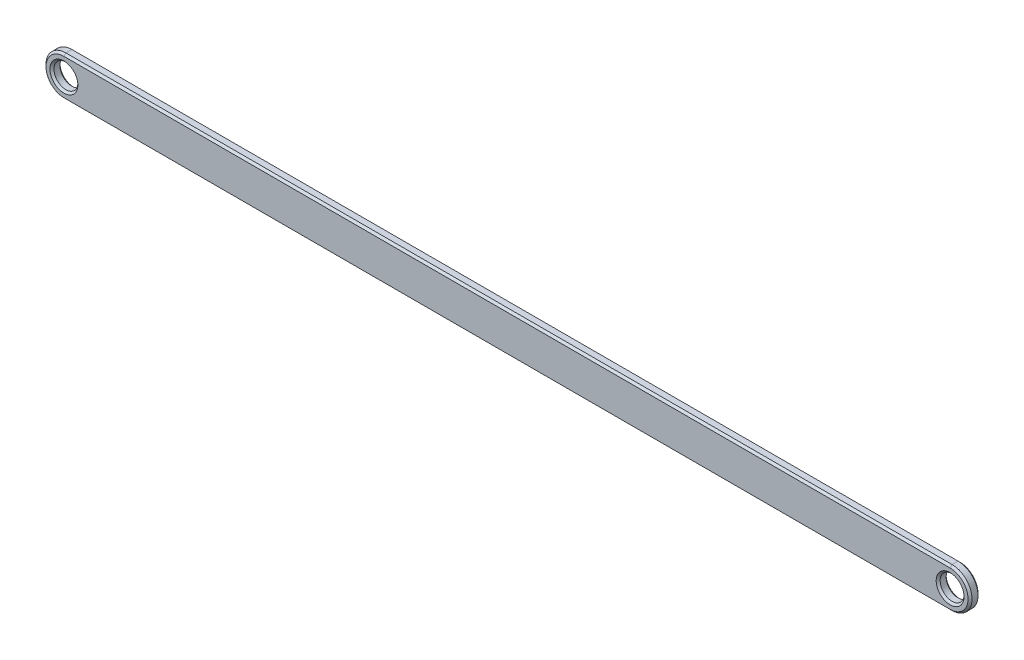
ISO-10303-21;
HEADER;
FILE_DESCRIPTION(('STEP AP214'),'2;1');
FILE_NAME('part.step','',(''),(''),'','','');
FILE_SCHEMA(('AUTOMOTIVE_DESIGN { 1 0 10303 214 1 1 1 1 }'));
ENDSEC;
DATA;
#1=APPLICATION_CONTEXT('core data for automotive mechanical design processes');
#2=APPLICATION_PROTOCOL_DEFINITION('international standard','automotive_design',2000,#1);
#3=PRODUCT_CONTEXT('',#1,'mechanical');
#4=PRODUCT('Part','Part','',(#3));
#5=PRODUCT_RELATED_PRODUCT_CATEGORY('part','',(#4));
#6=PRODUCT_DEFINITION_FORMATION('','',#4);
#7=PRODUCT_DEFINITION_CONTEXT('part definition',#1,'design');
#8=PRODUCT_DEFINITION('design','',#6,#7);
#9=PRODUCT_DEFINITION_SHAPE('','',#8);
#10=(LENGTH_UNIT() NAMED_UNIT(*) SI_UNIT(.MILLI.,.METRE.));
#11=(NAMED_UNIT(*) PLANE_ANGLE_UNIT() SI_UNIT($,.RADIAN.));
#12=(NAMED_UNIT(*) SI_UNIT($,.STERADIAN.) SOLID_ANGLE_UNIT());
#13=UNCERTAINTY_MEASURE_WITH_UNIT(LENGTH_MEASURE(1.E-05),#10,'distance_accuracy_value','');
#14=(GEOMETRIC_REPRESENTATION_CONTEXT(3) GLOBAL_UNCERTAINTY_ASSIGNED_CONTEXT((#13)) GLOBAL_UNIT_ASSIGNED_CONTEXT((#10,
#11,#12)) REPRESENTATION_CONTEXT('',''));
#15=CARTESIAN_POINT('',(0.,0.,0.));
#16=DIRECTION('',(0.,0.,1.));
#17=DIRECTION('',(1.,0.,0.));
#18=AXIS2_PLACEMENT_3D('',#15,#16,#17);
#19=CARTESIAN_POINT('',(-1112.5,0.,25.));
#20=DIRECTION('',(0.,0.,1.));
#21=DIRECTION('',(1.,0.,0.));
#22=AXIS2_PLACEMENT_3D('',#19,#20,#21);
#23=PLANE('',#22);
#24=CARTESIAN_POINT('',(1112.5,2.72483912810286E-13,25.));
#25=DIRECTION('',(0.,0.,1.));
#26=DIRECTION('',(1.,0.,0.));
#27=AXIS2_PLACEMENT_3D('',#24,#25,#26);
#28=CIRCLE('',#27,34.9999999999997);
#29=CARTESIAN_POINT('',(1147.5,2.72483912810286E-13,25.));
#30=VERTEX_POINT('',#29);
#31=EDGE_CURVE('E11',#30,#30,#28,.F.);
#32=ORIENTED_EDGE('',*,*,#31,.T.);
#33=EDGE_LOOP('',(#32));
#34=FACE_BOUND('',#33,.T.);
#35=CARTESIAN_POINT('',(1112.5,2.72483912810286E-13,25.));
#36=DIRECTION('',(0.,0.,1.));
#37=DIRECTION('',(1.,0.,0.));
#38=AXIS2_PLACEMENT_3D('',#35,#36,#37);
#39=CIRCLE('',#38,45.0000000000006);
#40=CARTESIAN_POINT('',(1112.5,-45.0000000000003,25.));
#41=VERTEX_POINT('',#40);
#42=CARTESIAN_POINT('',(1112.5,45.0000000000008,25.));
#43=VERTEX_POINT('',#42);
#44=EDGE_CURVE('E57',#41,#43,#39,.T.);
#45=ORIENTED_EDGE('',*,*,#44,.T.);
#46=DIRECTION('',(-1.,0.,0.));
#47=VECTOR('',#46,1.);
#48=CARTESIAN_POINT('',(-1112.5,45.0000000000005,25.));
#49=LINE('',#48,#47);
#50=CARTESIAN_POINT('',(-1112.5,45.0000000000006,25.));
#51=VERTEX_POINT('',#50);
#52=EDGE_CURVE('E49',#43,#51,#49,.T.);
#53=ORIENTED_EDGE('',*,*,#52,.T.);
#54=CARTESIAN_POINT('',(-1112.5,0.,25.));
#55=DIRECTION('',(0.,0.,1.));
#56=DIRECTION('',(1.,0.,0.));
#57=AXIS2_PLACEMENT_3D('',#54,#55,#56);
#58=CIRCLE('',#57,45.0000000000006);
#59=CARTESIAN_POINT('',(-1112.5,-45.0000000000006,25.));
#60=VERTEX_POINT('',#59);
#61=EDGE_CURVE('E194',#51,#60,#58,.T.);
#62=ORIENTED_EDGE('',*,*,#61,.T.);
#63=DIRECTION('',(1.,0.,0.));
#64=VECTOR('',#63,1.);
#65=CARTESIAN_POINT('',(1112.5,-45.0000000000003,25.));
#66=LINE('',#65,#64);
#67=EDGE_CURVE('E62',#60,#41,#66,.T.);
#68=ORIENTED_EDGE('',*,*,#67,.T.);
#69=EDGE_LOOP('',(#45,#53,#62,#68));
#70=FACE_BOUND('',#69,.T.);
#71=CARTESIAN_POINT('',(-1112.5,0.,25.));
#72=DIRECTION('',(0.,0.,1.));
#73=DIRECTION('',(1.,0.,0.));
#74=AXIS2_PLACEMENT_3D('',#71,#72,#73);
#75=CIRCLE('',#74,34.9999999999997);
#76=CARTESIAN_POINT('',(-1077.5,0.,25.));
#77=VERTEX_POINT('',#76);
#78=EDGE_CURVE('E190',#77,#77,#75,.F.);
#79=ORIENTED_EDGE('',*,*,#78,.T.);
#80=EDGE_LOOP('',(#79));
#81=FACE_BOUND('',#80,.T.);
#82=ADVANCED_FACE('F39',(#34,#70,#81),#23,.T.);
#83=CARTESIAN_POINT('',(-1112.5,0.,0.));
#84=DIRECTION('',(0.,0.,1.));
#85=DIRECTION('',(1.,0.,0.));
#86=AXIS2_PLACEMENT_3D('',#83,#84,#85);
#87=PLANE('',#86);
#88=CARTESIAN_POINT('',(1112.5,2.72483912810286E-13,0.));
#89=DIRECTION('',(0.,0.,1.));
#90=DIRECTION('',(1.,0.,0.));
#91=AXIS2_PLACEMENT_3D('',#88,#89,#90);
#92=CIRCLE('',#91,34.9999999999995);
#93=CARTESIAN_POINT('',(1147.5,2.72483912810286E-13,0.));
#94=VERTEX_POINT('',#93);
#95=EDGE_CURVE('E142',#94,#94,#92,.T.);
#96=ORIENTED_EDGE('',*,*,#95,.T.);
#97=EDGE_LOOP('',(#96));
#98=FACE_BOUND('',#97,.T.);
#99=CARTESIAN_POINT('',(-1112.5,0.,0.));
#100=DIRECTION('',(0.,0.,1.));
#101=DIRECTION('',(1.,0.,0.));
#102=AXIS2_PLACEMENT_3D('',#99,#100,#101);
#103=CIRCLE('',#102,34.9999999999995);
#104=CARTESIAN_POINT('',(-1077.5,0.,0.));
#105=VERTEX_POINT('',#104);
#106=EDGE_CURVE('E137',#105,#105,#103,.T.);
#107=ORIENTED_EDGE('',*,*,#106,.T.);
#108=EDGE_LOOP('',(#107));
#109=FACE_BOUND('',#108,.T.);
#110=CARTESIAN_POINT('',(1112.5,2.72483912810286E-13,0.));
#111=DIRECTION('',(0.,0.,1.));
#112=DIRECTION('',(1.,0.,0.));
#113=AXIS2_PLACEMENT_3D('',#110,#111,#112);
#114=CIRCLE('',#113,45.0000000000001);
#115=CARTESIAN_POINT('',(1112.5,45.0000000000004,0.));
#116=VERTEX_POINT('',#115);
#117=CARTESIAN_POINT('',(1112.5,-44.9999999999998,0.));
#118=VERTEX_POINT('',#117);
#119=EDGE_CURVE('E135',#116,#118,#114,.F.);
#120=ORIENTED_EDGE('',*,*,#119,.T.);
#121=DIRECTION('',(-1.,0.,0.));
#122=VECTOR('',#121,1.);
#123=CARTESIAN_POINT('',(-1112.5,-45.0000000000001,0.));
#124=LINE('',#123,#122);
#125=CARTESIAN_POINT('',(-1112.5,-45.0000000000001,0.));
#126=VERTEX_POINT('',#125);
#127=EDGE_CURVE('E112',#118,#126,#124,.T.);
#128=ORIENTED_EDGE('',*,*,#127,.T.);
#129=CARTESIAN_POINT('',(-1112.5,0.,0.));
#130=DIRECTION('',(0.,0.,1.));
#131=DIRECTION('',(1.,0.,0.));
#132=AXIS2_PLACEMENT_3D('',#129,#130,#131);
#133=CIRCLE('',#132,45.0000000000001);
#134=CARTESIAN_POINT('',(-1112.5,45.0000000000001,0.));
#135=VERTEX_POINT('',#134);
#136=EDGE_CURVE('E123',#126,#135,#133,.F.);
#137=ORIENTED_EDGE('',*,*,#136,.T.);
#138=DIRECTION('',(1.,0.,0.));
#139=VECTOR('',#138,1.);
#140=CARTESIAN_POINT('',(-1112.5,45.0000000000001,0.));
#141=LINE('',#140,#139);
#142=EDGE_CURVE('E130',#135,#116,#141,.T.);
#143=ORIENTED_EDGE('',*,*,#142,.T.);
#144=EDGE_LOOP('',(#120,#128,#137,#143));
#145=FACE_BOUND('',#144,.T.);
#146=ADVANCED_FACE('F133',(#98,#109,#145),#87,.F.);
#147=CARTESIAN_POINT('',(-1112.5,0.,25.));
#148=DIRECTION('',(0.,0.,-1.));
#149=DIRECTION('',(-1.,0.,0.));
#150=AXIS2_PLACEMENT_3D('',#147,#148,#149);
#151=CYLINDRICAL_SURFACE('',#150,50.);
#152=DIRECTION('',(0.,0.,-1.));
#153=VECTOR('',#152,1.);
#154=CARTESIAN_POINT('',(-1112.5,50.,25.));
#155=LINE('',#154,#153);
#156=CARTESIAN_POINT('',(-1112.5,50.,20.0000000000008));
#157=VERTEX_POINT('',#156);
#158=CARTESIAN_POINT('',(-1112.5,50.,4.9999999999999));
#159=VERTEX_POINT('',#158);
#160=EDGE_CURVE('E210',#157,#159,#155,.T.);
#161=ORIENTED_EDGE('',*,*,#160,.T.);
#162=CARTESIAN_POINT('',(-1112.5,0.,4.9999999999999));
#163=DIRECTION('',(0.,0.,1.));
#164=DIRECTION('',(1.,0.,0.));
#165=AXIS2_PLACEMENT_3D('',#162,#163,#164);
#166=CIRCLE('',#165,50.);
#167=CARTESIAN_POINT('',(-1112.5,-50.,4.9999999999999));
#168=VERTEX_POINT('',#167);
#169=EDGE_CURVE('E187',#159,#168,#166,.T.);
#170=ORIENTED_EDGE('',*,*,#169,.T.);
#171=DIRECTION('',(0.,0.,-1.));
#172=VECTOR('',#171,1.);
#173=CARTESIAN_POINT('',(-1112.5,-50.,25.));
#174=LINE('',#173,#172);
#175=CARTESIAN_POINT('',(-1112.5,-50.,20.0000000000008));
#176=VERTEX_POINT('',#175);
#177=EDGE_CURVE('E131',#176,#168,#174,.T.);
#178=ORIENTED_EDGE('',*,*,#177,.F.);
#179=CARTESIAN_POINT('',(-1112.5,0.,20.0000000000008));
#180=DIRECTION('',(0.,0.,1.));
#181=DIRECTION('',(1.,0.,0.));
#182=AXIS2_PLACEMENT_3D('',#179,#180,#181);
#183=CIRCLE('',#182,50.);
#184=EDGE_CURVE('E184',#176,#157,#183,.F.);
#185=ORIENTED_EDGE('',*,*,#184,.T.);
#186=EDGE_LOOP('',(#161,#170,#178,#185));
#187=FACE_BOUND('',#186,.T.);
#188=ADVANCED_FACE('F240',(#187),#151,.T.);
#189=CARTESIAN_POINT('',(1112.5,-49.9999999999997,25.));
#190=DIRECTION('',(0.,1.,0.));
#191=DIRECTION('',(-1.,0.,0.));
#192=AXIS2_PLACEMENT_3D('',#189,#190,#191);
#193=PLANE('',#192);
#194=ORIENTED_EDGE('',*,*,#177,.T.);
#195=DIRECTION('',(1.,0.,0.));
#196=VECTOR('',#195,1.);
#197=CARTESIAN_POINT('',(1112.5,-49.9999999999997,4.9999999999999));
#198=LINE('',#197,#196);
#199=CARTESIAN_POINT('',(1112.5,-49.9999999999997,4.9999999999999));
#200=VERTEX_POINT('',#199);
#201=EDGE_CURVE('E115',#168,#200,#198,.T.);
#202=ORIENTED_EDGE('',*,*,#201,.T.);
#203=DIRECTION('',(0.,0.,-1.));
#204=VECTOR('',#203,1.);
#205=CARTESIAN_POINT('',(1112.5,-49.9999999999997,25.));
#206=LINE('',#205,#204);
#207=CARTESIAN_POINT('',(1112.5,-49.9999999999997,20.0000000000008));
#208=VERTEX_POINT('',#207);
#209=EDGE_CURVE('E237',#208,#200,#206,.T.);
#210=ORIENTED_EDGE('',*,*,#209,.F.);
#211=DIRECTION('',(-1.,0.,0.));
#212=VECTOR('',#211,1.);
#213=CARTESIAN_POINT('',(-1112.5,-50.,20.0000000000008));
#214=LINE('',#213,#212);
#215=EDGE_CURVE('E166',#208,#176,#214,.T.);
#216=ORIENTED_EDGE('',*,*,#215,.T.);
#217=EDGE_LOOP('',(#194,#202,#210,#216));
#218=FACE_BOUND('',#217,.T.);
#219=ADVANCED_FACE('F235',(#218),#193,.F.);
#220=CARTESIAN_POINT('',(1112.5,2.72483912810286E-13,25.));
#221=DIRECTION('',(0.,0.,-1.));
#222=DIRECTION('',(-1.,0.,0.));
#223=AXIS2_PLACEMENT_3D('',#220,#221,#222);
#224=CYLINDRICAL_SURFACE('',#223,50.);
#225=ORIENTED_EDGE('',*,*,#209,.T.);
#226=CARTESIAN_POINT('',(1112.5,2.72483912810286E-13,4.9999999999999));
#227=DIRECTION('',(0.,0.,1.));
#228=DIRECTION('',(1.,0.,0.));
#229=AXIS2_PLACEMENT_3D('',#226,#227,#228);
#230=CIRCLE('',#229,50.);
#231=CARTESIAN_POINT('',(1112.5,50.0000000000003,4.9999999999999));
#232=VERTEX_POINT('',#231);
#233=EDGE_CURVE('E174',#200,#232,#230,.T.);
#234=ORIENTED_EDGE('',*,*,#233,.T.);
#235=DIRECTION('',(0.,0.,-1.));
#236=VECTOR('',#235,1.);
#237=CARTESIAN_POINT('',(1112.5,50.0000000000003,25.));
#238=LINE('',#237,#236);
#239=CARTESIAN_POINT('',(1112.5,50.0000000000003,20.0000000000008));
#240=VERTEX_POINT('',#239);
#241=EDGE_CURVE('E245',#240,#232,#238,.T.);
#242=ORIENTED_EDGE('',*,*,#241,.F.);
#243=CARTESIAN_POINT('',(1112.5,2.72483912810286E-13,20.0000000000008));
#244=DIRECTION('',(0.,0.,1.));
#245=DIRECTION('',(1.,0.,0.));
#246=AXIS2_PLACEMENT_3D('',#243,#244,#245);
#247=CIRCLE('',#246,50.);
#248=EDGE_CURVE('E171',#240,#208,#247,.F.);
#249=ORIENTED_EDGE('',*,*,#248,.T.);
#250=EDGE_LOOP('',(#225,#234,#242,#249));
#251=FACE_BOUND('',#250,.T.);
#252=ADVANCED_FACE('F259',(#251),#224,.T.);
#253=CARTESIAN_POINT('',(1112.5,50.0000000000003,25.));
#254=DIRECTION('',(0.,-1.,0.));
#255=DIRECTION('',(1.,0.,0.));
#256=AXIS2_PLACEMENT_3D('',#253,#254,#255);
#257=PLANE('',#256);
#258=ORIENTED_EDGE('',*,*,#241,.T.);
#259=DIRECTION('',(-1.,0.,0.));
#260=VECTOR('',#259,1.);
#261=CARTESIAN_POINT('',(1112.5,50.0000000000003,4.9999999999999));
#262=LINE('',#261,#260);
#263=EDGE_CURVE('E181',#232,#159,#262,.T.);
#264=ORIENTED_EDGE('',*,*,#263,.T.);
#265=ORIENTED_EDGE('',*,*,#160,.F.);
#266=DIRECTION('',(1.,0.,0.));
#267=VECTOR('',#266,1.);
#268=CARTESIAN_POINT('',(1112.5,50.0000000000003,20.0000000000008));
#269=LINE('',#268,#267);
#270=EDGE_CURVE('E177',#157,#240,#269,.T.);
#271=ORIENTED_EDGE('',*,*,#270,.T.);
#272=EDGE_LOOP('',(#258,#264,#265,#271));
#273=FACE_BOUND('',#272,.T.);
#274=ADVANCED_FACE('F265',(#273),#257,.F.);
#275=CARTESIAN_POINT('',(-1112.5,0.,25.));
#276=DIRECTION('',(0.,0.,-1.));
#277=DIRECTION('',(-1.,0.,0.));
#278=AXIS2_PLACEMENT_3D('',#275,#276,#277);
#279=CYLINDRICAL_SURFACE('',#278,29.9999999999998);
#280=CARTESIAN_POINT('',(-1112.5,0.,4.99999999999954));
#281=DIRECTION('',(0.,0.,1.));
#282=DIRECTION('',(1.,0.,0.));
#283=AXIS2_PLACEMENT_3D('',#280,#281,#282);
#284=CIRCLE('',#283,29.9999999999998);
#285=CARTESIAN_POINT('',(-1082.5,0.,4.99999999999954));
#286=VERTEX_POINT('',#285);
#287=EDGE_CURVE('E162',#286,#286,#284,.F.);
#288=ORIENTED_EDGE('',*,*,#287,.T.);
#289=EDGE_LOOP('',(#288));
#290=FACE_BOUND('',#289,.T.);
#291=CARTESIAN_POINT('',(-1112.5,0.,20.));
#292=DIRECTION('',(0.,0.,1.));
#293=DIRECTION('',(1.,0.,0.));
#294=AXIS2_PLACEMENT_3D('',#291,#292,#293);
#295=CIRCLE('',#294,29.9999999999998);
#296=CARTESIAN_POINT('',(-1082.5,0.,20.));
#297=VERTEX_POINT('',#296);
#298=EDGE_CURVE('E158',#297,#297,#295,.T.);
#299=ORIENTED_EDGE('',*,*,#298,.T.);
#300=EDGE_LOOP('',(#299));
#301=FACE_BOUND('',#300,.T.);
#302=ADVANCED_FACE('F281',(#290,#301),#279,.F.);
#303=CARTESIAN_POINT('',(1112.5,2.72483912810286E-13,25.));
#304=DIRECTION('',(0.,0.,-1.));
#305=DIRECTION('',(-1.,0.,0.));
#306=AXIS2_PLACEMENT_3D('',#303,#304,#305);
#307=CYLINDRICAL_SURFACE('',#306,29.9999999999998);
#308=CARTESIAN_POINT('',(1112.5,2.72483912810286E-13,4.99999999999954));
#309=DIRECTION('',(0.,0.,1.));
#310=DIRECTION('',(1.,0.,0.));
#311=AXIS2_PLACEMENT_3D('',#308,#309,#310);
#312=CIRCLE('',#311,29.9999999999998);
#313=CARTESIAN_POINT('',(1142.5,2.72483912810286E-13,4.99999999999954));
#314=VERTEX_POINT('',#313);
#315=EDGE_CURVE('E154',#314,#314,#312,.F.);
#316=ORIENTED_EDGE('',*,*,#315,.T.);
#317=EDGE_LOOP('',(#316));
#318=FACE_BOUND('',#317,.T.);
#319=CARTESIAN_POINT('',(1112.5,2.72483912810286E-13,20.));
#320=DIRECTION('',(0.,0.,1.));
#321=DIRECTION('',(1.,0.,0.));
#322=AXIS2_PLACEMENT_3D('',#319,#320,#321);
#323=CIRCLE('',#322,29.9999999999998);
#324=CARTESIAN_POINT('',(1142.5,2.72483912810286E-13,20.));
#325=VERTEX_POINT('',#324);
#326=EDGE_CURVE('E150',#325,#325,#323,.T.);
#327=ORIENTED_EDGE('',*,*,#326,.T.);
#328=EDGE_LOOP('',(#327));
#329=FACE_BOUND('',#328,.T.);
#330=ADVANCED_FACE('F283',(#318,#329),#307,.F.);
#331=CARTESIAN_POINT('',(1112.5,2.72483912810286E-13,0.));
#332=DIRECTION('',(0.,0.,-1.));
#333=DIRECTION('',(-1.,0.,0.));
#334=AXIS2_PLACEMENT_3D('',#331,#332,#333);
#335=CONICAL_SURFACE('',#334,34.9999999999995,0.78539816339746);
#336=ORIENTED_EDGE('',*,*,#315,.F.);
#337=EDGE_LOOP('',(#336));
#338=FACE_BOUND('',#337,.T.);
#339=ORIENTED_EDGE('',*,*,#95,.F.);
#340=EDGE_LOOP('',(#339));
#341=FACE_BOUND('',#340,.T.);
#342=ADVANCED_FACE('F290',(#338,#341),#335,.F.);
#343=CARTESIAN_POINT('',(-1112.5,0.,0.));
#344=DIRECTION('',(0.,0.,-1.));
#345=DIRECTION('',(-1.,0.,0.));
#346=AXIS2_PLACEMENT_3D('',#343,#344,#345);
#347=CONICAL_SURFACE('',#346,34.9999999999995,0.78539816339746);
#348=ORIENTED_EDGE('',*,*,#287,.F.);
#349=EDGE_LOOP('',(#348));
#350=FACE_BOUND('',#349,.T.);
#351=ORIENTED_EDGE('',*,*,#106,.F.);
#352=EDGE_LOOP('',(#351));
#353=FACE_BOUND('',#352,.T.);
#354=ADVANCED_FACE('F306',(#350,#353),#347,.F.);
#355=CARTESIAN_POINT('',(1112.5,50.0000000000003,4.9999999999999));
#356=DIRECTION('',(0.,-0.707106781186548,0.707106781186547));
#357=DIRECTION('',(-1.,0.,0.));
#358=AXIS2_PLACEMENT_3D('',#355,#356,#357);
#359=PLANE('',#358);
#360=DIRECTION('',(0.,0.707106781186547,0.707106781186548));
#361=VECTOR('',#360,1.);
#362=CARTESIAN_POINT('',(1112.5,45.0000000000004,0.));
#363=LINE('',#362,#361);
#364=EDGE_CURVE('E119',#116,#232,#363,.T.);
#365=ORIENTED_EDGE('',*,*,#364,.F.);
#366=ORIENTED_EDGE('',*,*,#142,.F.);
#367=DIRECTION('',(0.,-0.707106781186547,-0.707106781186548));
#368=VECTOR('',#367,1.);
#369=CARTESIAN_POINT('',(-1112.5,50.,4.9999999999999));
#370=LINE('',#369,#368);
#371=EDGE_CURVE('E126',#159,#135,#370,.T.);
#372=ORIENTED_EDGE('',*,*,#371,.F.);
#373=ORIENTED_EDGE('',*,*,#263,.F.);
#374=EDGE_LOOP('',(#365,#366,#372,#373));
#375=FACE_BOUND('',#374,.T.);
#376=ADVANCED_FACE('F252',(#375),#359,.F.);
#377=CARTESIAN_POINT('',(-1112.5,0.,4.9999999999999));
#378=DIRECTION('',(0.,0.,1.));
#379=DIRECTION('',(1.,0.,0.));
#380=AXIS2_PLACEMENT_3D('',#377,#378,#379);
#381=CONICAL_SURFACE('',#380,50.,0.785398163397448);
#382=ORIENTED_EDGE('',*,*,#371,.T.);
#383=ORIENTED_EDGE('',*,*,#136,.F.);
#384=DIRECTION('',(0.,0.707106781186547,-0.707106781186548));
#385=VECTOR('',#384,1.);
#386=CARTESIAN_POINT('',(-1112.5,-50.,4.9999999999999));
#387=LINE('',#386,#385);
#388=EDGE_CURVE('E108',#168,#126,#387,.T.);
#389=ORIENTED_EDGE('',*,*,#388,.F.);
#390=ORIENTED_EDGE('',*,*,#169,.F.);
#391=EDGE_LOOP('',(#382,#383,#389,#390));
#392=FACE_BOUND('',#391,.T.);
#393=ADVANCED_FACE('F124',(#392),#381,.T.);
#394=CARTESIAN_POINT('',(1112.5,2.72483912810286E-13,4.9999999999999));
#395=DIRECTION('',(0.,0.,1.));
#396=DIRECTION('',(1.,0.,0.));
#397=AXIS2_PLACEMENT_3D('',#394,#395,#396);
#398=CONICAL_SURFACE('',#397,50.,0.785398163397448);
#399=ORIENTED_EDGE('',*,*,#364,.T.);
#400=ORIENTED_EDGE('',*,*,#233,.F.);
#401=DIRECTION('',(0.,-0.707106781186547,0.707106781186548));
#402=VECTOR('',#401,1.);
#403=CARTESIAN_POINT('',(1112.5,-44.9999999999998,0.));
#404=LINE('',#403,#402);
#405=EDGE_CURVE('E120',#118,#200,#404,.T.);
#406=ORIENTED_EDGE('',*,*,#405,.F.);
#407=ORIENTED_EDGE('',*,*,#119,.F.);
#408=EDGE_LOOP('',(#399,#400,#406,#407));
#409=FACE_BOUND('',#408,.T.);
#410=ADVANCED_FACE('F255',(#409),#398,.T.);
#411=CARTESIAN_POINT('',(1112.5,-49.9999999999997,4.9999999999999));
#412=DIRECTION('',(0.,0.707106781186548,0.707106781186547));
#413=DIRECTION('',(1.,0.,0.));
#414=AXIS2_PLACEMENT_3D('',#411,#412,#413);
#415=PLANE('',#414);
#416=ORIENTED_EDGE('',*,*,#388,.T.);
#417=ORIENTED_EDGE('',*,*,#127,.F.);
#418=ORIENTED_EDGE('',*,*,#405,.T.);
#419=ORIENTED_EDGE('',*,*,#201,.F.);
#420=EDGE_LOOP('',(#416,#417,#418,#419));
#421=FACE_BOUND('',#420,.T.);
#422=ADVANCED_FACE('F110',(#421),#415,.F.);
#423=CARTESIAN_POINT('',(1112.5,2.72483912810286E-13,20.));
#424=DIRECTION('',(0.,0.,1.));
#425=DIRECTION('',(1.,0.,0.));
#426=AXIS2_PLACEMENT_3D('',#423,#424,#425);
#427=CONICAL_SURFACE('',#426,29.9999999999998,0.785398163397438);
#428=ORIENTED_EDGE('',*,*,#31,.F.);
#429=EDGE_LOOP('',(#428));
#430=FACE_BOUND('',#429,.T.);
#431=ORIENTED_EDGE('',*,*,#326,.F.);
#432=EDGE_LOOP('',(#431));
#433=FACE_BOUND('',#432,.T.);
#434=ADVANCED_FACE('F313',(#430,#433),#427,.F.);
#435=CARTESIAN_POINT('',(-1112.5,-45.0000000000006,25.));
#436=DIRECTION('',(0.,-0.707106781186532,0.707106781186563));
#437=DIRECTION('',(-1.,0.,0.));
#438=AXIS2_PLACEMENT_3D('',#435,#436,#437);
#439=PLANE('',#438);
#440=DIRECTION('',(0.,0.707106781186563,0.707106781186532));
#441=VECTOR('',#440,1.);
#442=CARTESIAN_POINT('',(-1112.5,-50.,20.0000000000008));
#443=LINE('',#442,#441);
#444=EDGE_CURVE('E216',#176,#60,#443,.T.);
#445=ORIENTED_EDGE('',*,*,#444,.F.);
#446=ORIENTED_EDGE('',*,*,#215,.F.);
#447=DIRECTION('',(0.,-0.707106781186563,-0.707106781186532));
#448=VECTOR('',#447,1.);
#449=CARTESIAN_POINT('',(1112.5,-45.0000000000003,25.));
#450=LINE('',#449,#448);
#451=EDGE_CURVE('E43',#41,#208,#450,.T.);
#452=ORIENTED_EDGE('',*,*,#451,.F.);
#453=ORIENTED_EDGE('',*,*,#67,.F.);
#454=EDGE_LOOP('',(#445,#446,#452,#453));
#455=FACE_BOUND('',#454,.T.);
#456=ADVANCED_FACE('F230',(#455),#439,.T.);
#457=CARTESIAN_POINT('',(1112.5,2.72483912810286E-13,25.));
#458=DIRECTION('',(0.,0.,-1.));
#459=DIRECTION('',(-1.,0.,0.));
#460=AXIS2_PLACEMENT_3D('',#457,#458,#459);
#461=CONICAL_SURFACE('',#460,45.0000000000006,0.78539816339747);
#462=ORIENTED_EDGE('',*,*,#451,.T.);
#463=ORIENTED_EDGE('',*,*,#248,.F.);
#464=DIRECTION('',(0.,0.707106781186563,-0.707106781186532));
#465=VECTOR('',#464,1.);
#466=CARTESIAN_POINT('',(1112.5,45.0000000000008,25.));
#467=LINE('',#466,#465);
#468=EDGE_CURVE('E214',#43,#240,#467,.T.);
#469=ORIENTED_EDGE('',*,*,#468,.F.);
#470=ORIENTED_EDGE('',*,*,#44,.F.);
#471=EDGE_LOOP('',(#462,#463,#469,#470));
#472=FACE_BOUND('',#471,.T.);
#473=ADVANCED_FACE('F227',(#472),#461,.T.);
#474=CARTESIAN_POINT('',(-1112.5,0.,25.));
#475=DIRECTION('',(0.,0.,-1.));
#476=DIRECTION('',(-1.,0.,0.));
#477=AXIS2_PLACEMENT_3D('',#474,#475,#476);
#478=CONICAL_SURFACE('',#477,45.0000000000006,0.78539816339747);
#479=ORIENTED_EDGE('',*,*,#444,.T.);
#480=ORIENTED_EDGE('',*,*,#61,.F.);
#481=DIRECTION('',(0.,-0.707106781186563,0.707106781186532));
#482=VECTOR('',#481,1.);
#483=CARTESIAN_POINT('',(-1112.5,50.,20.0000000000008));
#484=LINE('',#483,#482);
#485=EDGE_CURVE('E211',#157,#51,#484,.T.);
#486=ORIENTED_EDGE('',*,*,#485,.F.);
#487=ORIENTED_EDGE('',*,*,#184,.F.);
#488=EDGE_LOOP('',(#479,#480,#486,#487));
#489=FACE_BOUND('',#488,.T.);
#490=ADVANCED_FACE('F270',(#489),#478,.T.);
#491=CARTESIAN_POINT('',(-1112.5,45.0000000000005,25.));
#492=DIRECTION('',(0.,0.707106781186532,0.707106781186563));
#493=DIRECTION('',(1.,0.,0.));
#494=AXIS2_PLACEMENT_3D('',#491,#492,#493);
#495=PLANE('',#494);
#496=ORIENTED_EDGE('',*,*,#468,.T.);
#497=ORIENTED_EDGE('',*,*,#270,.F.);
#498=ORIENTED_EDGE('',*,*,#485,.T.);
#499=ORIENTED_EDGE('',*,*,#52,.F.);
#500=EDGE_LOOP('',(#496,#497,#498,#499));
#501=FACE_BOUND('',#500,.T.);
#502=ADVANCED_FACE('F268',(#501),#495,.T.);
#503=CARTESIAN_POINT('',(-1112.5,0.,20.));
#504=DIRECTION('',(0.,0.,1.));
#505=DIRECTION('',(1.,0.,0.));
#506=AXIS2_PLACEMENT_3D('',#503,#504,#505);
#507=CONICAL_SURFACE('',#506,29.9999999999998,0.785398163397438);
#508=ORIENTED_EDGE('',*,*,#78,.F.);
#509=EDGE_LOOP('',(#508));
#510=FACE_BOUND('',#509,.T.);
#511=ORIENTED_EDGE('',*,*,#298,.F.);
#512=EDGE_LOOP('',(#511));
#513=FACE_BOUND('',#512,.T.);
#514=ADVANCED_FACE('F41',(#510,#513),#507,.F.);
#515=CLOSED_SHELL('',(#82,#146,#188,#219,#252,#274,#302,#330,#342,#354,#376,#393,#410,#422,#434,
#456,#473,#490,#502,#514));
#516=MANIFOLD_SOLID_BREP('B2',#515);
#517=ADVANCED_BREP_SHAPE_REPRESENTATION('',(#18,#516),#14);
#518=SHAPE_DEFINITION_REPRESENTATION(#9,#517);
ENDSEC;
END-ISO-10303-21;
